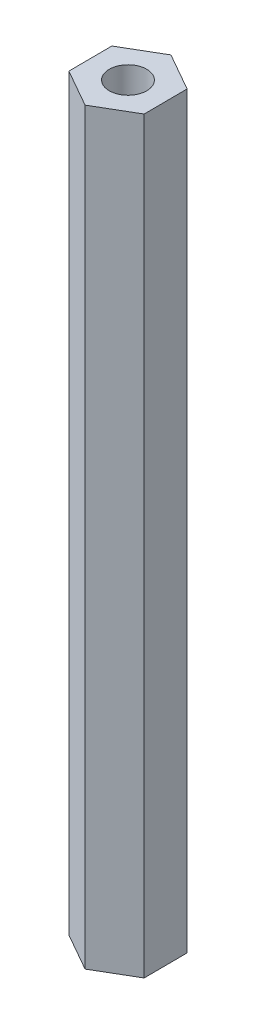
ISO-10303-21;
HEADER;
FILE_DESCRIPTION(('STEP AP214'),'2;1');
FILE_NAME('part.step','',(''),(''),'','','');
FILE_SCHEMA(('AUTOMOTIVE_DESIGN { 1 0 10303 214 1 1 1 1 }'));
ENDSEC;
DATA;
#1=APPLICATION_CONTEXT('core data for automotive mechanical design processes');
#2=APPLICATION_PROTOCOL_DEFINITION('international standard','automotive_design',2000,#1);
#3=PRODUCT_CONTEXT('',#1,'mechanical');
#4=PRODUCT('Part','Part','',(#3));
#5=PRODUCT_RELATED_PRODUCT_CATEGORY('part','',(#4));
#6=PRODUCT_DEFINITION_FORMATION('','',#4);
#7=PRODUCT_DEFINITION_CONTEXT('part definition',#1,'design');
#8=PRODUCT_DEFINITION('design','',#6,#7);
#9=PRODUCT_DEFINITION_SHAPE('','',#8);
#10=(LENGTH_UNIT() NAMED_UNIT(*) SI_UNIT(.MILLI.,.METRE.));
#11=(NAMED_UNIT(*) PLANE_ANGLE_UNIT() SI_UNIT($,.RADIAN.));
#12=(NAMED_UNIT(*) SI_UNIT($,.STERADIAN.) SOLID_ANGLE_UNIT());
#13=UNCERTAINTY_MEASURE_WITH_UNIT(LENGTH_MEASURE(1.E-05),#10,'distance_accuracy_value','');
#14=(GEOMETRIC_REPRESENTATION_CONTEXT(3) GLOBAL_UNCERTAINTY_ASSIGNED_CONTEXT((#13)) GLOBAL_UNIT_ASSIGNED_CONTEXT((#10,
#11,#12)) REPRESENTATION_CONTEXT('',''));
#15=CARTESIAN_POINT('',(0.,0.,0.));
#16=DIRECTION('',(0.,0.,1.));
#17=DIRECTION('',(1.,0.,0.));
#18=AXIS2_PLACEMENT_3D('',#15,#16,#17);
#19=CARTESIAN_POINT('',(-0.0143364974845344,0.,-2.30935657666225));
#20=DIRECTION('',(-0.505366552003245,0.,-0.862904773492621));
#21=DIRECTION('',(-0.862904773492621,0.,0.505366552003245));
#22=AXIS2_PLACEMENT_3D('',#19,#20,#21);
#23=PLANE('',#22);
#24=DIRECTION('',(0.,1.,0.));
#25=VECTOR('',#24,1.);
#26=CARTESIAN_POINT('',(-2.00712971052844,0.,-1.14226251730823));
#27=LINE('',#26,#25);
#28=CARTESIAN_POINT('',(-2.00712971052844,5.,-1.14226251730823));
#29=VERTEX_POINT('',#28);
#30=CARTESIAN_POINT('',(-2.00712971052844,45.,-1.14226251730823));
#31=VERTEX_POINT('',#30);
#32=EDGE_CURVE('E49',#29,#31,#27,.T.);
#33=ORIENTED_EDGE('',*,*,#32,.T.);
#34=DIRECTION('',(-0.862904773492621,0.,0.505366552003244));
#35=VECTOR('',#34,1.);
#36=CARTESIAN_POINT('',(-0.0143364974845344,45.,-2.30935657666225));
#37=LINE('',#36,#35);
#38=CARTESIAN_POINT('',(-0.0143364974845344,45.,-2.30935657666225));
#39=VERTEX_POINT('',#38);
#40=EDGE_CURVE('E97',#39,#31,#37,.T.);
#41=ORIENTED_EDGE('',*,*,#40,.F.);
#42=DIRECTION('',(0.,1.,0.));
#43=VECTOR('',#42,1.);
#44=CARTESIAN_POINT('',(-0.0143364974845344,0.,-2.30935657666225));
#45=LINE('',#44,#43);
#46=CARTESIAN_POINT('',(-0.0143364974845344,5.,-2.30935657666225));
#47=VERTEX_POINT('',#46);
#48=EDGE_CURVE('E107',#47,#39,#45,.T.);
#49=ORIENTED_EDGE('',*,*,#48,.F.);
#50=DIRECTION('',(-0.862904773492621,0.,0.505366552003245));
#51=VECTOR('',#50,1.);
#52=CARTESIAN_POINT('',(-0.512534800745511,5.,-2.01758306182374));
#53=LINE('',#52,#51);
#54=EDGE_CURVE('E11',#47,#29,#53,.T.);
#55=ORIENTED_EDGE('',*,*,#54,.T.);
#56=EDGE_LOOP('',(#33,#41,#49,#55));
#57=FACE_BOUND('',#56,.T.);
#58=ADVANCED_FACE('F40',(#57),#23,.T.);
#59=CARTESIAN_POINT('',(-2.00712971052844,0.,-1.14226251730823));
#60=DIRECTION('',(-0.999980730893089,0.,0.0062078855114494));
#61=DIRECTION('',(0.,1.,0.));
#62=AXIS2_PLACEMENT_3D('',#59,#60,#61);
#63=PLANE('',#62);
#64=DIRECTION('',(0.,1.,0.));
#65=VECTOR('',#64,1.);
#66=CARTESIAN_POINT('',(-1.99279321304391,0.,1.16709405935403));
#67=LINE('',#66,#65);
#68=CARTESIAN_POINT('',(-1.99279321304391,5.,1.16709405935403));
#69=VERTEX_POINT('',#68);
#70=CARTESIAN_POINT('',(-1.99279321304391,45.,1.16709405935403));
#71=VERTEX_POINT('',#70);
#72=EDGE_CURVE('E124',#69,#71,#67,.T.);
#73=ORIENTED_EDGE('',*,*,#72,.T.);
#74=DIRECTION('',(0.00620788551144729,0.,0.999980730893089));
#75=VECTOR('',#74,1.);
#76=CARTESIAN_POINT('',(-2.00712971052844,45.,-1.14226251730823));
#77=LINE('',#76,#75);
#78=EDGE_CURVE('E110',#31,#71,#77,.T.);
#79=ORIENTED_EDGE('',*,*,#78,.F.);
#80=ORIENTED_EDGE('',*,*,#32,.F.);
#81=DIRECTION('',(0.0062078855114494,0.,0.999980730893089));
#82=VECTOR('',#81,1.);
#83=CARTESIAN_POINT('',(-2.00354558615731,5.,-0.564923373142665));
#84=LINE('',#83,#82);
#85=EDGE_CURVE('E126',#29,#69,#84,.T.);
#86=ORIENTED_EDGE('',*,*,#85,.T.);
#87=EDGE_LOOP('',(#73,#79,#80,#86));
#88=FACE_BOUND('',#87,.T.);
#89=ADVANCED_FACE('F159',(#88),#63,.T.);
#90=CARTESIAN_POINT('',(-1.99279321304391,0.,1.16709405935403));
#91=DIRECTION('',(-0.494614178889844,0.,0.869112659004071));
#92=DIRECTION('',(0.,1.,0.));
#93=AXIS2_PLACEMENT_3D('',#90,#91,#92);
#94=PLANE('',#93);
#95=DIRECTION('',(0.,1.,0.));
#96=VECTOR('',#95,1.);
#97=CARTESIAN_POINT('',(0.0143364974845356,0.,2.30935657666225));
#98=LINE('',#97,#96);
#99=CARTESIAN_POINT('',(0.0143364974845356,5.,2.30935657666225));
#100=VERTEX_POINT('',#99);
#101=CARTESIAN_POINT('',(0.0143364974845356,45.,2.30935657666225));
#102=VERTEX_POINT('',#101);
#103=EDGE_CURVE('E129',#100,#102,#98,.T.);
#104=ORIENTED_EDGE('',*,*,#103,.T.);
#105=DIRECTION('',(0.869112659004072,0.,0.494614178889841));
#106=VECTOR('',#105,1.);
#107=CARTESIAN_POINT('',(-1.99279321304391,45.,1.16709405935403));
#108=LINE('',#107,#106);
#109=EDGE_CURVE('E162',#71,#102,#108,.T.);
#110=ORIENTED_EDGE('',*,*,#109,.F.);
#111=ORIENTED_EDGE('',*,*,#72,.F.);
#112=DIRECTION('',(0.86911265900407,0.,0.494614178889844));
#113=VECTOR('',#112,1.);
#114=CARTESIAN_POINT('',(-1.4910107854118,5.,1.45265968868109));
#115=LINE('',#114,#113);
#116=EDGE_CURVE('E127',#69,#100,#115,.T.);
#117=ORIENTED_EDGE('',*,*,#116,.T.);
#118=EDGE_LOOP('',(#104,#110,#111,#117));
#119=FACE_BOUND('',#118,.T.);
#120=ADVANCED_FACE('F166',(#119),#94,.T.);
#121=CARTESIAN_POINT('',(0.0143364974845356,0.,2.30935657666225));
#122=DIRECTION('',(0.505366552003245,0.,0.862904773492621));
#123=DIRECTION('',(0.,-1.,0.));
#124=AXIS2_PLACEMENT_3D('',#121,#122,#123);
#125=PLANE('',#124);
#126=DIRECTION('',(0.,1.,0.));
#127=VECTOR('',#126,1.);
#128=CARTESIAN_POINT('',(2.00712971052845,0.,1.14226251730823));
#129=LINE('',#128,#127);
#130=CARTESIAN_POINT('',(2.00712971052845,5.,1.14226251730823));
#131=VERTEX_POINT('',#130);
#132=CARTESIAN_POINT('',(2.00712971052845,45.,1.14226251730823));
#133=VERTEX_POINT('',#132);
#134=EDGE_CURVE('E133',#131,#133,#129,.T.);
#135=ORIENTED_EDGE('',*,*,#134,.T.);
#136=DIRECTION('',(0.862904773492623,0.,-0.505366552003243));
#137=VECTOR('',#136,1.);
#138=CARTESIAN_POINT('',(0.0143364974845356,45.,2.30935657666225));
#139=LINE('',#138,#137);
#140=EDGE_CURVE('E150',#102,#133,#139,.T.);
#141=ORIENTED_EDGE('',*,*,#140,.F.);
#142=ORIENTED_EDGE('',*,*,#103,.F.);
#143=DIRECTION('',(0.862904773492621,0.,-0.505366552003245));
#144=VECTOR('',#143,1.);
#145=CARTESIAN_POINT('',(0.512534800745512,5.,2.01758306182374));
#146=LINE('',#145,#144);
#147=EDGE_CURVE('E131',#100,#131,#146,.T.);
#148=ORIENTED_EDGE('',*,*,#147,.T.);
#149=EDGE_LOOP('',(#135,#141,#142,#148));
#150=FACE_BOUND('',#149,.T.);
#151=ADVANCED_FACE('F148',(#150),#125,.T.);
#152=CARTESIAN_POINT('',(2.00712971052845,0.,1.14226251730823));
#153=DIRECTION('',(0.999980730893089,0.,-0.00620788551144964));
#154=DIRECTION('',(0.,-1.,0.));
#155=AXIS2_PLACEMENT_3D('',#152,#153,#154);
#156=PLANE('',#155);
#157=DIRECTION('',(0.,1.,0.));
#158=VECTOR('',#157,1.);
#159=CARTESIAN_POINT('',(1.99279321304391,0.,-1.16709405935403));
#160=LINE('',#159,#158);
#161=CARTESIAN_POINT('',(1.99279321304391,5.,-1.16709405935403));
#162=VERTEX_POINT('',#161);
#163=CARTESIAN_POINT('',(1.99279321304391,45.,-1.16709405935403));
#164=VERTEX_POINT('',#163);
#165=EDGE_CURVE('E115',#162,#164,#160,.T.);
#166=ORIENTED_EDGE('',*,*,#165,.T.);
#167=DIRECTION('',(-0.00620788551145161,0.,-0.999980730893089));
#168=VECTOR('',#167,1.);
#169=CARTESIAN_POINT('',(2.00712971052845,45.,1.14226251730823));
#170=LINE('',#169,#168);
#171=EDGE_CURVE('E56',#133,#164,#170,.T.);
#172=ORIENTED_EDGE('',*,*,#171,.F.);
#173=ORIENTED_EDGE('',*,*,#134,.F.);
#174=DIRECTION('',(-0.00620788551144964,0.,-0.999980730893089));
#175=VECTOR('',#174,1.);
#176=CARTESIAN_POINT('',(2.00354558615732,5.,0.564923373142665));
#177=LINE('',#176,#175);
#178=EDGE_CURVE('E117',#131,#162,#177,.T.);
#179=ORIENTED_EDGE('',*,*,#178,.T.);
#180=EDGE_LOOP('',(#166,#172,#173,#179));
#181=FACE_BOUND('',#180,.T.);
#182=ADVANCED_FACE('F42',(#181),#156,.T.);
#183=CARTESIAN_POINT('',(1.99279321304391,0.,-1.16709405935403));
#184=DIRECTION('',(0.494614178889844,0.,-0.86911265900407));
#185=DIRECTION('',(0.,-1.,0.));
#186=AXIS2_PLACEMENT_3D('',#183,#184,#185);
#187=PLANE('',#186);
#188=ORIENTED_EDGE('',*,*,#48,.T.);
#189=DIRECTION('',(-0.869112659004072,0.,-0.494614178889841));
#190=VECTOR('',#189,1.);
#191=CARTESIAN_POINT('',(1.99279321304391,45.,-1.16709405935403));
#192=LINE('',#191,#190);
#193=EDGE_CURVE('E94',#164,#39,#192,.T.);
#194=ORIENTED_EDGE('',*,*,#193,.F.);
#195=ORIENTED_EDGE('',*,*,#165,.F.);
#196=DIRECTION('',(-0.86911265900407,0.,-0.494614178889844));
#197=VECTOR('',#196,1.);
#198=CARTESIAN_POINT('',(1.4910107854118,5.,-1.45265968868109));
#199=LINE('',#198,#197);
#200=EDGE_CURVE('E114',#162,#47,#199,.T.);
#201=ORIENTED_EDGE('',*,*,#200,.T.);
#202=EDGE_LOOP('',(#188,#194,#195,#201));
#203=FACE_BOUND('',#202,.T.);
#204=ADVANCED_FACE('F112',(#203),#187,.T.);
#205=CARTESIAN_POINT('',(0.,0.,0.));
#206=DIRECTION('',(0.,1.,0.));
#207=DIRECTION('',(-1.,0.,0.));
#208=AXIS2_PLACEMENT_3D('',#205,#206,#207);
#209=CYLINDRICAL_SURFACE('',#208,1.);
#210=CARTESIAN_POINT('',(0.,45.,0.));
#211=DIRECTION('',(0.,1.,0.));
#212=DIRECTION('',(0.,0.,1.));
#213=AXIS2_PLACEMENT_3D('',#210,#211,#212);
#214=CIRCLE('',#213,1.);
#215=CARTESIAN_POINT('',(1.,45.,0.));
#216=VERTEX_POINT('',#215);
#217=EDGE_CURVE('E44',#216,#216,#214,.F.);
#218=ORIENTED_EDGE('',*,*,#217,.F.);
#219=DIRECTION('',(0.,1.,0.));
#220=VECTOR('',#219,1.);
#221=CARTESIAN_POINT('',(1.,0.,0.));
#222=LINE('',#221,#220);
#223=CARTESIAN_POINT('',(1.,5.,0.));
#224=VERTEX_POINT('',#223);
#225=EDGE_CURVE('E119',#224,#216,#222,.T.);
#226=ORIENTED_EDGE('',*,*,#225,.F.);
#227=CARTESIAN_POINT('',(0.,5.,0.));
#228=DIRECTION('',(0.,1.,0.));
#229=DIRECTION('',(-1.,0.,0.));
#230=AXIS2_PLACEMENT_3D('',#227,#228,#229);
#231=CIRCLE('',#230,1.);
#232=EDGE_CURVE('E138',#224,#224,#231,.T.);
#233=ORIENTED_EDGE('',*,*,#232,.F.);
#234=ORIENTED_EDGE('',*,*,#225,.T.);
#235=EDGE_LOOP('',(#218,#226,#233,#234));
#236=FACE_BOUND('',#235,.T.);
#237=ADVANCED_FACE('F181',(#236),#209,.F.);
#238=CARTESIAN_POINT('',(0.,5.,0.));
#239=DIRECTION('',(0.,1.,0.));
#240=DIRECTION('',(1.,0.,0.));
#241=AXIS2_PLACEMENT_3D('',#238,#239,#240);
#242=PLANE('',#241);
#243=ORIENTED_EDGE('',*,*,#232,.T.);
#244=EDGE_LOOP('',(#243));
#245=FACE_BOUND('',#244,.T.);
#246=ORIENTED_EDGE('',*,*,#54,.F.);
#247=ORIENTED_EDGE('',*,*,#200,.F.);
#248=ORIENTED_EDGE('',*,*,#178,.F.);
#249=ORIENTED_EDGE('',*,*,#147,.F.);
#250=ORIENTED_EDGE('',*,*,#116,.F.);
#251=ORIENTED_EDGE('',*,*,#85,.F.);
#252=EDGE_LOOP('',(#246,#247,#248,#249,#250,#251));
#253=FACE_BOUND('',#252,.T.);
#254=ADVANCED_FACE('F155',(#245,#253),#242,.F.);
#255=CARTESIAN_POINT('',(0.,45.,0.));
#256=DIRECTION('',(0.,1.,0.));
#257=DIRECTION('',(0.,0.,1.));
#258=AXIS2_PLACEMENT_3D('',#255,#256,#257);
#259=PLANE('',#258);
#260=ORIENTED_EDGE('',*,*,#193,.T.);
#261=ORIENTED_EDGE('',*,*,#40,.T.);
#262=ORIENTED_EDGE('',*,*,#78,.T.);
#263=ORIENTED_EDGE('',*,*,#109,.T.);
#264=ORIENTED_EDGE('',*,*,#140,.T.);
#265=ORIENTED_EDGE('',*,*,#171,.T.);
#266=EDGE_LOOP('',(#260,#261,#262,#263,#264,#265));
#267=FACE_BOUND('',#266,.T.);
#268=ORIENTED_EDGE('',*,*,#217,.T.);
#269=EDGE_LOOP('',(#268));
#270=FACE_BOUND('',#269,.T.);
#271=ADVANCED_FACE('F96',(#267,#270),#259,.T.);
#272=CLOSED_SHELL('',(#58,#89,#120,#151,#182,#204,#237,#254,#271));
#273=MANIFOLD_SOLID_BREP('B2',#272);
#274=ADVANCED_BREP_SHAPE_REPRESENTATION('',(#18,#273),#14);
#275=SHAPE_DEFINITION_REPRESENTATION(#9,#274);
ENDSEC;
END-ISO-10303-21;
